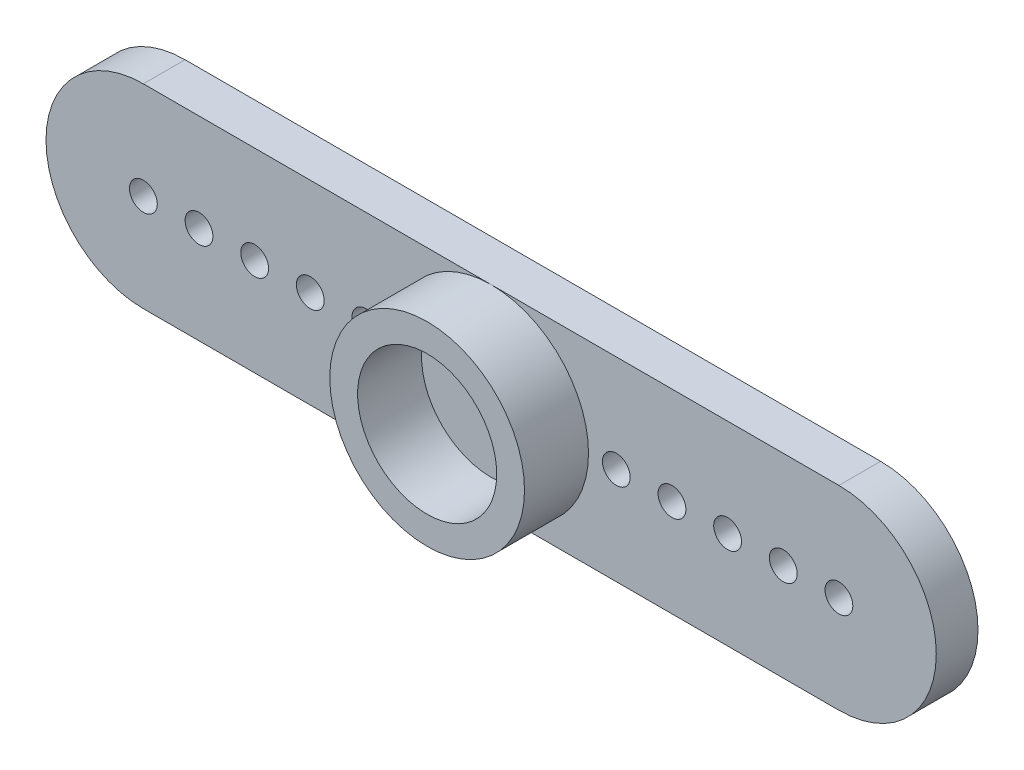
ISO-10303-21;
HEADER;
FILE_DESCRIPTION(('STEP AP214'),'2;1');
FILE_NAME('part.step','',(''),(''),'','','');
FILE_SCHEMA(('AUTOMOTIVE_DESIGN { 1 0 10303 214 1 1 1 1 }'));
ENDSEC;
DATA;
#1=APPLICATION_CONTEXT('core data for automotive mechanical design processes');
#2=APPLICATION_PROTOCOL_DEFINITION('international standard','automotive_design',2000,#1);
#3=PRODUCT_CONTEXT('',#1,'mechanical');
#4=PRODUCT('Part','Part','',(#3));
#5=PRODUCT_RELATED_PRODUCT_CATEGORY('part','',(#4));
#6=PRODUCT_DEFINITION_FORMATION('','',#4);
#7=PRODUCT_DEFINITION_CONTEXT('part definition',#1,'design');
#8=PRODUCT_DEFINITION('design','',#6,#7);
#9=PRODUCT_DEFINITION_SHAPE('','',#8);
#10=(LENGTH_UNIT() NAMED_UNIT(*) SI_UNIT(.MILLI.,.METRE.));
#11=(NAMED_UNIT(*) PLANE_ANGLE_UNIT() SI_UNIT($,.RADIAN.));
#12=(NAMED_UNIT(*) SI_UNIT($,.STERADIAN.) SOLID_ANGLE_UNIT());
#13=UNCERTAINTY_MEASURE_WITH_UNIT(LENGTH_MEASURE(1.E-05),#10,'distance_accuracy_value','');
#14=(GEOMETRIC_REPRESENTATION_CONTEXT(3) GLOBAL_UNCERTAINTY_ASSIGNED_CONTEXT((#13)) GLOBAL_UNIT_ASSIGNED_CONTEXT((#10,
#11,#12)) REPRESENTATION_CONTEXT('',''));
#15=CARTESIAN_POINT('',(0.,0.,0.));
#16=DIRECTION('',(0.,0.,1.));
#17=DIRECTION('',(1.,0.,0.));
#18=AXIS2_PLACEMENT_3D('',#15,#16,#17);
#19=CARTESIAN_POINT('',(0.,0.,1.5));
#20=DIRECTION('',(0.,0.,1.));
#21=DIRECTION('',(1.,0.,0.));
#22=AXIS2_PLACEMENT_3D('',#19,#20,#21);
#23=PLANE('',#22);
#24=CARTESIAN_POINT('',(2.,0.,1.5));
#25=DIRECTION('',(0.,0.,1.));
#26=DIRECTION('',(1.,0.,0.));
#27=AXIS2_PLACEMENT_3D('',#24,#25,#26);
#28=CIRCLE('',#27,0.500000000000001);
#29=CARTESIAN_POINT('',(2.5,0.,1.5));
#30=VERTEX_POINT('',#29);
#31=EDGE_CURVE('E364',#30,#30,#28,.F.);
#32=ORIENTED_EDGE('',*,*,#31,.T.);
#33=EDGE_LOOP('',(#32));
#34=FACE_BOUND('',#33,.T.);
#35=CARTESIAN_POINT('',(4.,0.,1.5));
#36=DIRECTION('',(0.,0.,1.));
#37=DIRECTION('',(1.,0.,0.));
#38=AXIS2_PLACEMENT_3D('',#35,#36,#37);
#39=CIRCLE('',#38,0.500000000000001);
#40=CARTESIAN_POINT('',(4.5,0.,1.5));
#41=VERTEX_POINT('',#40);
#42=EDGE_CURVE('E368',#41,#41,#39,.F.);
#43=ORIENTED_EDGE('',*,*,#42,.T.);
#44=EDGE_LOOP('',(#43));
#45=FACE_BOUND('',#44,.T.);
#46=CARTESIAN_POINT('',(6.,0.,1.5));
#47=DIRECTION('',(0.,0.,1.));
#48=DIRECTION('',(1.,0.,0.));
#49=AXIS2_PLACEMENT_3D('',#46,#47,#48);
#50=CIRCLE('',#49,0.500000000000001);
#51=CARTESIAN_POINT('',(6.5,0.,1.5));
#52=VERTEX_POINT('',#51);
#53=EDGE_CURVE('E390',#52,#52,#50,.F.);
#54=ORIENTED_EDGE('',*,*,#53,.T.);
#55=EDGE_LOOP('',(#54));
#56=FACE_BOUND('',#55,.T.);
#57=CARTESIAN_POINT('',(8.,0.,1.5));
#58=DIRECTION('',(0.,0.,1.));
#59=DIRECTION('',(1.,0.,0.));
#60=AXIS2_PLACEMENT_3D('',#57,#58,#59);
#61=CIRCLE('',#60,0.500000000000001);
#62=CARTESIAN_POINT('',(8.5,0.,1.5));
#63=VERTEX_POINT('',#62);
#64=EDGE_CURVE('E385',#63,#63,#61,.F.);
#65=ORIENTED_EDGE('',*,*,#64,.T.);
#66=EDGE_LOOP('',(#65));
#67=FACE_BOUND('',#66,.T.);
#68=CARTESIAN_POINT('',(0.,0.,1.5));
#69=DIRECTION('',(0.,0.,1.));
#70=DIRECTION('',(1.,0.,0.));
#71=AXIS2_PLACEMENT_3D('',#68,#69,#70);
#72=CIRCLE('',#71,0.5);
#73=CARTESIAN_POINT('',(0.5,0.,1.5));
#74=VERTEX_POINT('',#73);
#75=EDGE_CURVE('E165',#74,#74,#72,.T.);
#76=ORIENTED_EDGE('',*,*,#75,.F.);
#77=EDGE_LOOP('',(#76));
#78=FACE_BOUND('',#77,.T.);
#79=CARTESIAN_POINT('',(12.5,0.,1.5));
#80=DIRECTION('',(0.,0.,1.));
#81=DIRECTION('',(1.,0.,0.));
#82=AXIS2_PLACEMENT_3D('',#79,#80,#81);
#83=CIRCLE('',#82,3.5);
#84=CARTESIAN_POINT('',(12.5,3.5,1.5));
#85=VERTEX_POINT('',#84);
#86=CARTESIAN_POINT('',(12.5,-3.5,1.5));
#87=VERTEX_POINT('',#86);
#88=EDGE_CURVE('E42',#85,#87,#83,.T.);
#89=ORIENTED_EDGE('',*,*,#88,.F.);
#90=DIRECTION('',(-1.,0.,0.));
#91=VECTOR('',#90,1.);
#92=CARTESIAN_POINT('',(0.,3.5,1.5));
#93=LINE('',#92,#91);
#94=CARTESIAN_POINT('',(0.,3.5,1.5));
#95=VERTEX_POINT('',#94);
#96=EDGE_CURVE('E56',#85,#95,#93,.T.);
#97=ORIENTED_EDGE('',*,*,#96,.T.);
#98=CARTESIAN_POINT('',(0.,0.,1.5));
#99=DIRECTION('',(0.,0.,1.));
#100=DIRECTION('',(1.,0.,0.));
#101=AXIS2_PLACEMENT_3D('',#98,#99,#100);
#102=CIRCLE('',#101,3.5);
#103=CARTESIAN_POINT('',(0.,-3.5,1.5));
#104=VERTEX_POINT('',#103);
#105=EDGE_CURVE('E182',#95,#104,#102,.T.);
#106=ORIENTED_EDGE('',*,*,#105,.T.);
#107=DIRECTION('',(1.,0.,0.));
#108=VECTOR('',#107,1.);
#109=CARTESIAN_POINT('',(0.,-3.5,1.5));
#110=LINE('',#109,#108);
#111=EDGE_CURVE('E85',#104,#87,#110,.T.);
#112=ORIENTED_EDGE('',*,*,#111,.T.);
#113=EDGE_LOOP('',(#89,#97,#106,#112));
#114=FACE_BOUND('',#113,.T.);
#115=ADVANCED_FACE('F32',(#34,#45,#56,#67,#78,#114),#23,.T.);
#116=CARTESIAN_POINT('',(0.,0.,1.5));
#117=DIRECTION('',(0.,0.,-1.));
#118=DIRECTION('',(-1.,0.,0.));
#119=AXIS2_PLACEMENT_3D('',#116,#117,#118);
#120=CYLINDRICAL_SURFACE('',#119,3.5);
#121=CARTESIAN_POINT('',(0.,0.,0.));
#122=DIRECTION('',(0.,0.,1.));
#123=DIRECTION('',(1.,0.,0.));
#124=AXIS2_PLACEMENT_3D('',#121,#122,#123);
#125=CIRCLE('',#124,3.5);
#126=CARTESIAN_POINT('',(0.,3.5,0.));
#127=VERTEX_POINT('',#126);
#128=CARTESIAN_POINT('',(0.,-3.5,0.));
#129=VERTEX_POINT('',#128);
#130=EDGE_CURVE('E180',#127,#129,#125,.T.);
#131=ORIENTED_EDGE('',*,*,#130,.T.);
#132=DIRECTION('',(0.,0.,-1.));
#133=VECTOR('',#132,1.);
#134=CARTESIAN_POINT('',(0.,-3.5,1.5));
#135=LINE('',#134,#133);
#136=EDGE_CURVE('E36',#104,#129,#135,.T.);
#137=ORIENTED_EDGE('',*,*,#136,.F.);
#138=ORIENTED_EDGE('',*,*,#105,.F.);
#139=DIRECTION('',(0.,0.,-1.));
#140=VECTOR('',#139,1.);
#141=CARTESIAN_POINT('',(0.,3.5,1.5));
#142=LINE('',#141,#140);
#143=EDGE_CURVE('E93',#95,#127,#142,.T.);
#144=ORIENTED_EDGE('',*,*,#143,.T.);
#145=EDGE_LOOP('',(#131,#137,#138,#144));
#146=FACE_BOUND('',#145,.T.);
#147=ADVANCED_FACE('F34',(#146),#120,.T.);
#148=CARTESIAN_POINT('',(0.,-3.5,1.5));
#149=DIRECTION('',(0.,1.,0.));
#150=DIRECTION('',(-1.,0.,0.));
#151=AXIS2_PLACEMENT_3D('',#148,#149,#150);
#152=PLANE('',#151);
#153=DIRECTION('',(1.,0.,0.));
#154=VECTOR('',#153,1.);
#155=CARTESIAN_POINT('',(0.,-3.5,0.));
#156=LINE('',#155,#154);
#157=CARTESIAN_POINT('',(25.,-3.5,0.));
#158=VERTEX_POINT('',#157);
#159=EDGE_CURVE('E189',#129,#158,#156,.T.);
#160=ORIENTED_EDGE('',*,*,#159,.T.);
#161=DIRECTION('',(0.,0.,-1.));
#162=VECTOR('',#161,1.);
#163=CARTESIAN_POINT('',(25.,-3.5,1.5));
#164=LINE('',#163,#162);
#165=CARTESIAN_POINT('',(25.,-3.5,1.5));
#166=VERTEX_POINT('',#165);
#167=EDGE_CURVE('E196',#166,#158,#164,.T.);
#168=ORIENTED_EDGE('',*,*,#167,.F.);
#169=EDGE_CURVE('E184',#87,#166,#110,.T.);
#170=ORIENTED_EDGE('',*,*,#169,.F.);
#171=ORIENTED_EDGE('',*,*,#111,.F.);
#172=ORIENTED_EDGE('',*,*,#136,.T.);
#173=EDGE_LOOP('',(#160,#168,#170,#171,#172));
#174=FACE_BOUND('',#173,.T.);
#175=ADVANCED_FACE('F124',(#174),#152,.F.);
#176=CARTESIAN_POINT('',(25.,0.,1.5));
#177=DIRECTION('',(0.,0.,-1.));
#178=DIRECTION('',(-1.,0.,0.));
#179=AXIS2_PLACEMENT_3D('',#176,#177,#178);
#180=CYLINDRICAL_SURFACE('',#179,3.5);
#181=CARTESIAN_POINT('',(25.,0.,0.));
#182=DIRECTION('',(0.,0.,1.));
#183=DIRECTION('',(1.,0.,0.));
#184=AXIS2_PLACEMENT_3D('',#181,#182,#183);
#185=CIRCLE('',#184,3.5);
#186=CARTESIAN_POINT('',(25.,3.5,0.));
#187=VERTEX_POINT('',#186);
#188=EDGE_CURVE('E191',#158,#187,#185,.T.);
#189=ORIENTED_EDGE('',*,*,#188,.T.);
#190=DIRECTION('',(0.,0.,-1.));
#191=VECTOR('',#190,1.);
#192=CARTESIAN_POINT('',(25.,3.5,1.5));
#193=LINE('',#192,#191);
#194=CARTESIAN_POINT('',(25.,3.5,1.5));
#195=VERTEX_POINT('',#194);
#196=EDGE_CURVE('E195',#195,#187,#193,.T.);
#197=ORIENTED_EDGE('',*,*,#196,.F.);
#198=CARTESIAN_POINT('',(25.,0.,1.5));
#199=DIRECTION('',(0.,0.,1.));
#200=DIRECTION('',(1.,0.,0.));
#201=AXIS2_PLACEMENT_3D('',#198,#199,#200);
#202=CIRCLE('',#201,3.5);
#203=EDGE_CURVE('E91',#166,#195,#202,.T.);
#204=ORIENTED_EDGE('',*,*,#203,.F.);
#205=ORIENTED_EDGE('',*,*,#167,.T.);
#206=EDGE_LOOP('',(#189,#197,#204,#205));
#207=FACE_BOUND('',#206,.T.);
#208=ADVANCED_FACE('F139',(#207),#180,.T.);
#209=CARTESIAN_POINT('',(0.,3.5,1.5));
#210=DIRECTION('',(0.,-1.,0.));
#211=DIRECTION('',(1.,0.,0.));
#212=AXIS2_PLACEMENT_3D('',#209,#210,#211);
#213=PLANE('',#212);
#214=DIRECTION('',(-1.,0.,0.));
#215=VECTOR('',#214,1.);
#216=CARTESIAN_POINT('',(0.,3.5,0.));
#217=LINE('',#216,#215);
#218=EDGE_CURVE('E78',#187,#127,#217,.T.);
#219=ORIENTED_EDGE('',*,*,#218,.T.);
#220=ORIENTED_EDGE('',*,*,#143,.F.);
#221=ORIENTED_EDGE('',*,*,#96,.F.);
#222=EDGE_CURVE('E88',#195,#85,#93,.T.);
#223=ORIENTED_EDGE('',*,*,#222,.F.);
#224=ORIENTED_EDGE('',*,*,#196,.T.);
#225=EDGE_LOOP('',(#219,#220,#221,#223,#224));
#226=FACE_BOUND('',#225,.T.);
#227=ADVANCED_FACE('F95',(#226),#213,.F.);
#228=CARTESIAN_POINT('',(21.,0.,1.5));
#229=DIRECTION('',(0.,0.,1.));
#230=DIRECTION('',(1.,0.,0.));
#231=AXIS2_PLACEMENT_3D('',#228,#229,#230);
#232=CIRCLE('',#231,0.500000000000003);
#233=CARTESIAN_POINT('',(21.5,0.,1.5));
#234=VERTEX_POINT('',#233);
#235=EDGE_CURVE('E144',#234,#234,#232,.F.);
#236=ORIENTED_EDGE('',*,*,#235,.T.);
#237=EDGE_LOOP('',(#236));
#238=FACE_BOUND('',#237,.T.);
#239=CARTESIAN_POINT('',(19.,0.,1.5));
#240=DIRECTION('',(0.,0.,1.));
#241=DIRECTION('',(1.,0.,0.));
#242=AXIS2_PLACEMENT_3D('',#239,#240,#241);
#243=CIRCLE('',#242,0.499999999999999);
#244=CARTESIAN_POINT('',(19.5,0.,1.5));
#245=VERTEX_POINT('',#244);
#246=EDGE_CURVE('E148',#245,#245,#243,.F.);
#247=ORIENTED_EDGE('',*,*,#246,.T.);
#248=EDGE_LOOP('',(#247));
#249=FACE_BOUND('',#248,.T.);
#250=CARTESIAN_POINT('',(17.,0.,1.5));
#251=DIRECTION('',(0.,0.,1.));
#252=DIRECTION('',(1.,0.,0.));
#253=AXIS2_PLACEMENT_3D('',#250,#251,#252);
#254=CIRCLE('',#253,0.499999999999999);
#255=CARTESIAN_POINT('',(17.5,0.,1.5));
#256=VERTEX_POINT('',#255);
#257=EDGE_CURVE('E152',#256,#256,#254,.F.);
#258=ORIENTED_EDGE('',*,*,#257,.T.);
#259=EDGE_LOOP('',(#258));
#260=FACE_BOUND('',#259,.T.);
#261=CARTESIAN_POINT('',(23.,0.,1.5));
#262=DIRECTION('',(0.,0.,1.));
#263=DIRECTION('',(1.,0.,0.));
#264=AXIS2_PLACEMENT_3D('',#261,#262,#263);
#265=CIRCLE('',#264,0.500000000000003);
#266=CARTESIAN_POINT('',(23.5,0.,1.5));
#267=VERTEX_POINT('',#266);
#268=EDGE_CURVE('E156',#267,#267,#265,.F.);
#269=ORIENTED_EDGE('',*,*,#268,.T.);
#270=EDGE_LOOP('',(#269));
#271=FACE_BOUND('',#270,.T.);
#272=CARTESIAN_POINT('',(25.,0.,1.5));
#273=DIRECTION('',(0.,0.,1.));
#274=DIRECTION('',(1.,0.,0.));
#275=AXIS2_PLACEMENT_3D('',#272,#273,#274);
#276=CIRCLE('',#275,0.500000000000003);
#277=CARTESIAN_POINT('',(25.5,0.,1.5));
#278=VERTEX_POINT('',#277);
#279=EDGE_CURVE('E159',#278,#278,#276,.T.);
#280=ORIENTED_EDGE('',*,*,#279,.F.);
#281=EDGE_LOOP('',(#280));
#282=FACE_BOUND('',#281,.T.);
#283=EDGE_CURVE('E11',#87,#85,#83,.T.);
#284=ORIENTED_EDGE('',*,*,#283,.F.);
#285=ORIENTED_EDGE('',*,*,#169,.T.);
#286=ORIENTED_EDGE('',*,*,#203,.T.);
#287=ORIENTED_EDGE('',*,*,#222,.T.);
#288=EDGE_LOOP('',(#284,#285,#286,#287));
#289=FACE_BOUND('',#288,.T.);
#290=ADVANCED_FACE('F89',(#238,#249,#260,#271,#282,#289),#23,.T.);
#291=CARTESIAN_POINT('',(0.,0.,0.));
#292=DIRECTION('',(0.,0.,1.));
#293=DIRECTION('',(1.,0.,0.));
#294=AXIS2_PLACEMENT_3D('',#291,#292,#293);
#295=PLANE('',#294);
#296=CARTESIAN_POINT('',(2.,0.,0.));
#297=DIRECTION('',(0.,0.,-1.));
#298=DIRECTION('',(-1.,0.,0.));
#299=AXIS2_PLACEMENT_3D('',#296,#297,#298);
#300=CIRCLE('',#299,0.500000000000001);
#301=CARTESIAN_POINT('',(1.5,0.,0.));
#302=VERTEX_POINT('',#301);
#303=EDGE_CURVE('E367',#302,#302,#300,.T.);
#304=ORIENTED_EDGE('',*,*,#303,.F.);
#305=EDGE_LOOP('',(#304));
#306=FACE_BOUND('',#305,.T.);
#307=CARTESIAN_POINT('',(21.,0.,0.));
#308=DIRECTION('',(0.,0.,-1.));
#309=DIRECTION('',(1.,0.,0.));
#310=AXIS2_PLACEMENT_3D('',#307,#308,#309);
#311=CIRCLE('',#310,0.500000000000003);
#312=CARTESIAN_POINT('',(21.5,0.,0.));
#313=VERTEX_POINT('',#312);
#314=EDGE_CURVE('E373',#313,#313,#311,.T.);
#315=ORIENTED_EDGE('',*,*,#314,.F.);
#316=EDGE_LOOP('',(#315));
#317=FACE_BOUND('',#316,.T.);
#318=CARTESIAN_POINT('',(19.,0.,0.));
#319=DIRECTION('',(0.,0.,-1.));
#320=DIRECTION('',(1.,0.,0.));
#321=AXIS2_PLACEMENT_3D('',#318,#319,#320);
#322=CIRCLE('',#321,0.499999999999999);
#323=CARTESIAN_POINT('',(19.5,0.,0.));
#324=VERTEX_POINT('',#323);
#325=EDGE_CURVE('E381',#324,#324,#322,.T.);
#326=ORIENTED_EDGE('',*,*,#325,.F.);
#327=EDGE_LOOP('',(#326));
#328=FACE_BOUND('',#327,.T.);
#329=CARTESIAN_POINT('',(17.,0.,0.));
#330=DIRECTION('',(0.,0.,-1.));
#331=DIRECTION('',(1.,0.,0.));
#332=AXIS2_PLACEMENT_3D('',#329,#330,#331);
#333=CIRCLE('',#332,0.499999999999999);
#334=CARTESIAN_POINT('',(17.5,0.,0.));
#335=VERTEX_POINT('',#334);
#336=EDGE_CURVE('E425',#335,#335,#333,.T.);
#337=ORIENTED_EDGE('',*,*,#336,.F.);
#338=EDGE_LOOP('',(#337));
#339=FACE_BOUND('',#338,.T.);
#340=CARTESIAN_POINT('',(4.,0.,0.));
#341=DIRECTION('',(0.,0.,-1.));
#342=DIRECTION('',(-1.,0.,0.));
#343=AXIS2_PLACEMENT_3D('',#340,#341,#342);
#344=CIRCLE('',#343,0.500000000000001);
#345=CARTESIAN_POINT('',(3.5,0.,0.));
#346=VERTEX_POINT('',#345);
#347=EDGE_CURVE('E371',#346,#346,#344,.T.);
#348=ORIENTED_EDGE('',*,*,#347,.F.);
#349=EDGE_LOOP('',(#348));
#350=FACE_BOUND('',#349,.T.);
#351=CARTESIAN_POINT('',(6.,0.,0.));
#352=DIRECTION('',(0.,0.,-1.));
#353=DIRECTION('',(-1.,0.,0.));
#354=AXIS2_PLACEMENT_3D('',#351,#352,#353);
#355=CIRCLE('',#354,0.500000000000001);
#356=CARTESIAN_POINT('',(5.5,0.,0.));
#357=VERTEX_POINT('',#356);
#358=EDGE_CURVE('E387',#357,#357,#355,.T.);
#359=ORIENTED_EDGE('',*,*,#358,.F.);
#360=EDGE_LOOP('',(#359));
#361=FACE_BOUND('',#360,.T.);
#362=CARTESIAN_POINT('',(23.,0.,0.));
#363=DIRECTION('',(0.,0.,-1.));
#364=DIRECTION('',(1.,0.,0.));
#365=AXIS2_PLACEMENT_3D('',#362,#363,#364);
#366=CIRCLE('',#365,0.500000000000003);
#367=CARTESIAN_POINT('',(23.5,0.,0.));
#368=VERTEX_POINT('',#367);
#369=EDGE_CURVE('E382',#368,#368,#366,.T.);
#370=ORIENTED_EDGE('',*,*,#369,.F.);
#371=EDGE_LOOP('',(#370));
#372=FACE_BOUND('',#371,.T.);
#373=CARTESIAN_POINT('',(8.,0.,0.));
#374=DIRECTION('',(0.,0.,-1.));
#375=DIRECTION('',(-1.,0.,0.));
#376=AXIS2_PLACEMENT_3D('',#373,#374,#375);
#377=CIRCLE('',#376,0.500000000000001);
#378=CARTESIAN_POINT('',(7.5,0.,0.));
#379=VERTEX_POINT('',#378);
#380=EDGE_CURVE('E168',#379,#379,#377,.T.);
#381=ORIENTED_EDGE('',*,*,#380,.F.);
#382=EDGE_LOOP('',(#381));
#383=FACE_BOUND('',#382,.T.);
#384=CARTESIAN_POINT('',(25.,0.,0.));
#385=DIRECTION('',(0.,0.,-1.));
#386=DIRECTION('',(1.,0.,0.));
#387=AXIS2_PLACEMENT_3D('',#384,#385,#386);
#388=CIRCLE('',#387,0.500000000000003);
#389=CARTESIAN_POINT('',(25.5,0.,0.));
#390=VERTEX_POINT('',#389);
#391=EDGE_CURVE('E162',#390,#390,#388,.T.);
#392=ORIENTED_EDGE('',*,*,#391,.F.);
#393=EDGE_LOOP('',(#392));
#394=FACE_BOUND('',#393,.T.);
#395=CARTESIAN_POINT('',(0.,0.,0.));
#396=DIRECTION('',(0.,0.,-1.));
#397=DIRECTION('',(-1.,0.,0.));
#398=AXIS2_PLACEMENT_3D('',#395,#396,#397);
#399=CIRCLE('',#398,0.5);
#400=CARTESIAN_POINT('',(-0.5,0.,0.));
#401=VERTEX_POINT('',#400);
#402=EDGE_CURVE('E161',#401,#401,#399,.T.);
#403=ORIENTED_EDGE('',*,*,#402,.F.);
#404=EDGE_LOOP('',(#403));
#405=FACE_BOUND('',#404,.T.);
#406=ORIENTED_EDGE('',*,*,#130,.F.);
#407=ORIENTED_EDGE('',*,*,#218,.F.);
#408=ORIENTED_EDGE('',*,*,#188,.F.);
#409=ORIENTED_EDGE('',*,*,#159,.F.);
#410=EDGE_LOOP('',(#406,#407,#408,#409));
#411=FACE_BOUND('',#410,.T.);
#412=ADVANCED_FACE('F114',(#306,#317,#328,#339,#350,#361,#372,#383,#394,#405,#411),#295,.F.);
#413=CARTESIAN_POINT('',(12.5,0.,3.8));
#414=DIRECTION('',(0.,0.,1.));
#415=DIRECTION('',(1.,0.,0.));
#416=AXIS2_PLACEMENT_3D('',#413,#414,#415);
#417=PLANE('',#416);
#418=CARTESIAN_POINT('',(12.5,0.,3.8));
#419=DIRECTION('',(0.,0.,1.));
#420=DIRECTION('',(1.,0.,0.));
#421=AXIS2_PLACEMENT_3D('',#418,#419,#420);
#422=CIRCLE('',#421,3.5);
#423=CARTESIAN_POINT('',(16.,0.,3.8));
#424=VERTEX_POINT('',#423);
#425=EDGE_CURVE('E99',#424,#424,#422,.T.);
#426=ORIENTED_EDGE('',*,*,#425,.T.);
#427=EDGE_LOOP('',(#426));
#428=FACE_BOUND('',#427,.T.);
#429=CARTESIAN_POINT('',(12.5,0.,3.8));
#430=DIRECTION('',(0.,0.,1.));
#431=DIRECTION('',(1.,0.,0.));
#432=AXIS2_PLACEMENT_3D('',#429,#430,#431);
#433=CIRCLE('',#432,2.5);
#434=CARTESIAN_POINT('',(15.,0.,3.8));
#435=VERTEX_POINT('',#434);
#436=EDGE_CURVE('E100',#435,#435,#433,.T.);
#437=ORIENTED_EDGE('',*,*,#436,.F.);
#438=EDGE_LOOP('',(#437));
#439=FACE_BOUND('',#438,.T.);
#440=ADVANCED_FACE('F104',(#428,#439),#417,.T.);
#441=CARTESIAN_POINT('',(12.5,0.,3.8));
#442=DIRECTION('',(0.,0.,-1.));
#443=DIRECTION('',(-1.,0.,0.));
#444=AXIS2_PLACEMENT_3D('',#441,#442,#443);
#445=CYLINDRICAL_SURFACE('',#444,3.5);
#446=ORIENTED_EDGE('',*,*,#425,.F.);
#447=EDGE_LOOP('',(#446));
#448=FACE_BOUND('',#447,.T.);
#449=ORIENTED_EDGE('',*,*,#88,.T.);
#450=ORIENTED_EDGE('',*,*,#283,.T.);
#451=EDGE_LOOP('',(#449,#450));
#452=FACE_BOUND('',#451,.T.);
#453=ADVANCED_FACE('F101',(#448,#452),#445,.T.);
#454=CARTESIAN_POINT('',(12.5,0.,3.8));
#455=DIRECTION('',(0.,0.,-1.));
#456=DIRECTION('',(-1.,0.,0.));
#457=AXIS2_PLACEMENT_3D('',#454,#455,#456);
#458=CYLINDRICAL_SURFACE('',#457,2.5);
#459=ORIENTED_EDGE('',*,*,#436,.T.);
#460=EDGE_LOOP('',(#459));
#461=FACE_BOUND('',#460,.T.);
#462=CARTESIAN_POINT('',(12.5,0.,1.5));
#463=DIRECTION('',(0.,0.,1.));
#464=DIRECTION('',(1.,0.,0.));
#465=AXIS2_PLACEMENT_3D('',#462,#463,#464);
#466=CIRCLE('',#465,2.5);
#467=CARTESIAN_POINT('',(15.,0.,1.5));
#468=VERTEX_POINT('',#467);
#469=EDGE_CURVE('E174',#468,#468,#466,.T.);
#470=ORIENTED_EDGE('',*,*,#469,.F.);
#471=EDGE_LOOP('',(#470));
#472=FACE_BOUND('',#471,.T.);
#473=ADVANCED_FACE('F103',(#461,#472),#458,.F.);
#474=ORIENTED_EDGE('',*,*,#469,.T.);
#475=EDGE_LOOP('',(#474));
#476=FACE_BOUND('',#475,.T.);
#477=ADVANCED_FACE('F111',(#476),#23,.T.);
#478=CARTESIAN_POINT('',(0.,0.,3.8));
#479=DIRECTION('',(0.,0.,-1.));
#480=DIRECTION('',(-1.,0.,0.));
#481=AXIS2_PLACEMENT_3D('',#478,#479,#480);
#482=CYLINDRICAL_SURFACE('',#481,0.5);
#483=ORIENTED_EDGE('',*,*,#75,.T.);
#484=EDGE_LOOP('',(#483));
#485=FACE_BOUND('',#484,.T.);
#486=ORIENTED_EDGE('',*,*,#402,.T.);
#487=EDGE_LOOP('',(#486));
#488=FACE_BOUND('',#487,.T.);
#489=ADVANCED_FACE('F130',(#485,#488),#482,.F.);
#490=CARTESIAN_POINT('',(25.,0.,3.8));
#491=DIRECTION('',(0.,0.,-1.));
#492=DIRECTION('',(-1.,0.,0.));
#493=AXIS2_PLACEMENT_3D('',#490,#491,#492);
#494=CYLINDRICAL_SURFACE('',#493,0.500000000000003);
#495=ORIENTED_EDGE('',*,*,#279,.T.);
#496=EDGE_LOOP('',(#495));
#497=FACE_BOUND('',#496,.T.);
#498=ORIENTED_EDGE('',*,*,#391,.T.);
#499=EDGE_LOOP('',(#498));
#500=FACE_BOUND('',#499,.T.);
#501=ADVANCED_FACE('F270',(#497,#500),#494,.F.);
#502=CARTESIAN_POINT('',(8.,0.,3.801));
#503=DIRECTION('',(0.,0.,-1.));
#504=DIRECTION('',(-1.,0.,0.));
#505=AXIS2_PLACEMENT_3D('',#502,#503,#504);
#506=CYLINDRICAL_SURFACE('',#505,0.500000000000001);
#507=ORIENTED_EDGE('',*,*,#64,.F.);
#508=EDGE_LOOP('',(#507));
#509=FACE_BOUND('',#508,.T.);
#510=ORIENTED_EDGE('',*,*,#380,.T.);
#511=EDGE_LOOP('',(#510));
#512=FACE_BOUND('',#511,.T.);
#513=ADVANCED_FACE('F278',(#509,#512),#506,.F.);
#514=CARTESIAN_POINT('',(23.,0.,3.801));
#515=DIRECTION('',(0.,0.,-1.));
#516=DIRECTION('',(-1.,0.,0.));
#517=AXIS2_PLACEMENT_3D('',#514,#515,#516);
#518=CYLINDRICAL_SURFACE('',#517,0.500000000000003);
#519=ORIENTED_EDGE('',*,*,#268,.F.);
#520=EDGE_LOOP('',(#519));
#521=FACE_BOUND('',#520,.T.);
#522=ORIENTED_EDGE('',*,*,#369,.T.);
#523=EDGE_LOOP('',(#522));
#524=FACE_BOUND('',#523,.T.);
#525=ADVANCED_FACE('F285',(#521,#524),#518,.F.);
#526=CARTESIAN_POINT('',(6.,0.,3.801));
#527=DIRECTION('',(0.,0.,-1.));
#528=DIRECTION('',(-1.,0.,0.));
#529=AXIS2_PLACEMENT_3D('',#526,#527,#528);
#530=CYLINDRICAL_SURFACE('',#529,0.500000000000001);
#531=ORIENTED_EDGE('',*,*,#53,.F.);
#532=EDGE_LOOP('',(#531));
#533=FACE_BOUND('',#532,.T.);
#534=ORIENTED_EDGE('',*,*,#358,.T.);
#535=EDGE_LOOP('',(#534));
#536=FACE_BOUND('',#535,.T.);
#537=ADVANCED_FACE('F294',(#533,#536),#530,.F.);
#538=CARTESIAN_POINT('',(4.,0.,3.801));
#539=DIRECTION('',(0.,0.,-1.));
#540=DIRECTION('',(-1.,0.,0.));
#541=AXIS2_PLACEMENT_3D('',#538,#539,#540);
#542=CYLINDRICAL_SURFACE('',#541,0.500000000000001);
#543=ORIENTED_EDGE('',*,*,#42,.F.);
#544=EDGE_LOOP('',(#543));
#545=FACE_BOUND('',#544,.T.);
#546=ORIENTED_EDGE('',*,*,#347,.T.);
#547=EDGE_LOOP('',(#546));
#548=FACE_BOUND('',#547,.T.);
#549=ADVANCED_FACE('F303',(#545,#548),#542,.F.);
#550=CARTESIAN_POINT('',(17.,0.,3.801));
#551=DIRECTION('',(0.,0.,-1.));
#552=DIRECTION('',(-1.,0.,0.));
#553=AXIS2_PLACEMENT_3D('',#550,#551,#552);
#554=CYLINDRICAL_SURFACE('',#553,0.499999999999999);
#555=ORIENTED_EDGE('',*,*,#257,.F.);
#556=EDGE_LOOP('',(#555));
#557=FACE_BOUND('',#556,.T.);
#558=ORIENTED_EDGE('',*,*,#336,.T.);
#559=EDGE_LOOP('',(#558));
#560=FACE_BOUND('',#559,.T.);
#561=ADVANCED_FACE('F312',(#557,#560),#554,.F.);
#562=CARTESIAN_POINT('',(19.,0.,3.801));
#563=DIRECTION('',(0.,0.,-1.));
#564=DIRECTION('',(-1.,0.,0.));
#565=AXIS2_PLACEMENT_3D('',#562,#563,#564);
#566=CYLINDRICAL_SURFACE('',#565,0.499999999999999);
#567=ORIENTED_EDGE('',*,*,#246,.F.);
#568=EDGE_LOOP('',(#567));
#569=FACE_BOUND('',#568,.T.);
#570=ORIENTED_EDGE('',*,*,#325,.T.);
#571=EDGE_LOOP('',(#570));
#572=FACE_BOUND('',#571,.T.);
#573=ADVANCED_FACE('F321',(#569,#572),#566,.F.);
#574=CARTESIAN_POINT('',(21.,0.,3.801));
#575=DIRECTION('',(0.,0.,-1.));
#576=DIRECTION('',(-1.,0.,0.));
#577=AXIS2_PLACEMENT_3D('',#574,#575,#576);
#578=CYLINDRICAL_SURFACE('',#577,0.500000000000003);
#579=ORIENTED_EDGE('',*,*,#235,.F.);
#580=EDGE_LOOP('',(#579));
#581=FACE_BOUND('',#580,.T.);
#582=ORIENTED_EDGE('',*,*,#314,.T.);
#583=EDGE_LOOP('',(#582));
#584=FACE_BOUND('',#583,.T.);
#585=ADVANCED_FACE('F330',(#581,#584),#578,.F.);
#586=CARTESIAN_POINT('',(2.,0.,3.801));
#587=DIRECTION('',(0.,0.,-1.));
#588=DIRECTION('',(-1.,0.,0.));
#589=AXIS2_PLACEMENT_3D('',#586,#587,#588);
#590=CYLINDRICAL_SURFACE('',#589,0.500000000000001);
#591=ORIENTED_EDGE('',*,*,#31,.F.);
#592=EDGE_LOOP('',(#591));
#593=FACE_BOUND('',#592,.T.);
#594=ORIENTED_EDGE('',*,*,#303,.T.);
#595=EDGE_LOOP('',(#594));
#596=FACE_BOUND('',#595,.T.);
#597=ADVANCED_FACE('F339',(#593,#596),#590,.F.);
#598=CLOSED_SHELL('',(#115,#147,#175,#208,#227,#290,#412,#440,#453,#473,#477,#489,#501,#513,
#525,#537,#549,#561,#573,#585,#597));
#599=MANIFOLD_SOLID_BREP('B2',#598);
#600=ADVANCED_BREP_SHAPE_REPRESENTATION('',(#18,#599),#14);
#601=SHAPE_DEFINITION_REPRESENTATION(#9,#600);
ENDSEC;
END-ISO-10303-21;
